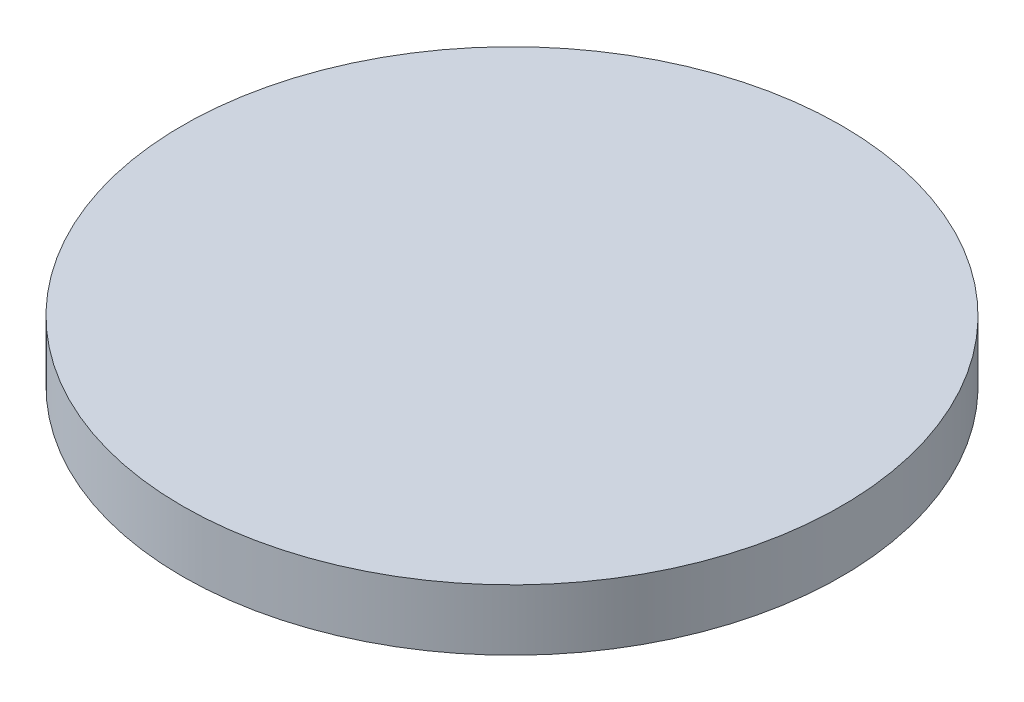
ISO-10303-21;
HEADER;
FILE_DESCRIPTION(('STEP AP214'),'2;1');
FILE_NAME('part.step','',(''),(''),'','','');
FILE_SCHEMA(('AUTOMOTIVE_DESIGN { 1 0 10303 214 1 1 1 1 }'));
ENDSEC;
DATA;
#1=APPLICATION_CONTEXT('core data for automotive mechanical design processes');
#2=APPLICATION_PROTOCOL_DEFINITION('international standard','automotive_design',2000,#1);
#3=PRODUCT_CONTEXT('',#1,'mechanical');
#4=PRODUCT('Part','Part','',(#3));
#5=PRODUCT_RELATED_PRODUCT_CATEGORY('part','',(#4));
#6=PRODUCT_DEFINITION_FORMATION('','',#4);
#7=PRODUCT_DEFINITION_CONTEXT('part definition',#1,'design');
#8=PRODUCT_DEFINITION('design','',#6,#7);
#9=PRODUCT_DEFINITION_SHAPE('','',#8);
#10=(LENGTH_UNIT() NAMED_UNIT(*) SI_UNIT(.MILLI.,.METRE.));
#11=(NAMED_UNIT(*) PLANE_ANGLE_UNIT() SI_UNIT($,.RADIAN.));
#12=(NAMED_UNIT(*) SI_UNIT($,.STERADIAN.) SOLID_ANGLE_UNIT());
#13=UNCERTAINTY_MEASURE_WITH_UNIT(LENGTH_MEASURE(1.E-05),#10,'distance_accuracy_value','');
#14=(GEOMETRIC_REPRESENTATION_CONTEXT(3) GLOBAL_UNCERTAINTY_ASSIGNED_CONTEXT((#13)) GLOBAL_UNIT_ASSIGNED_CONTEXT((#10,
#11,#12)) REPRESENTATION_CONTEXT('',''));
#15=CARTESIAN_POINT('',(0.,0.,0.));
#16=DIRECTION('',(0.,0.,1.));
#17=DIRECTION('',(1.,0.,0.));
#18=AXIS2_PLACEMENT_3D('',#15,#16,#17);
#19=CARTESIAN_POINT('',(0.,7.4,0.));
#20=DIRECTION('',(0.,-1.,0.));
#21=DIRECTION('',(0.,0.,-1.));
#22=AXIS2_PLACEMENT_3D('',#19,#20,#21);
#23=CYLINDRICAL_SURFACE('',#22,40.);
#24=CARTESIAN_POINT('',(0.,7.4,0.));
#25=DIRECTION('',(0.,1.,0.));
#26=DIRECTION('',(0.,0.,1.));
#27=AXIS2_PLACEMENT_3D('',#24,#25,#26);
#28=CIRCLE('',#27,40.);
#29=CARTESIAN_POINT('',(0.,7.4,40.0000000000001));
#30=VERTEX_POINT('',#29);
#31=EDGE_CURVE('E10',#30,#30,#28,.T.);
#32=ORIENTED_EDGE('',*,*,#31,.F.);
#33=EDGE_LOOP('',(#32));
#34=FACE_BOUND('',#33,.T.);
#35=CARTESIAN_POINT('',(0.,0.,0.));
#36=DIRECTION('',(0.,1.,0.));
#37=DIRECTION('',(0.,0.,1.));
#38=AXIS2_PLACEMENT_3D('',#35,#36,#37);
#39=CIRCLE('',#38,40.);
#40=CARTESIAN_POINT('',(0.,0.,40.0000000000001));
#41=VERTEX_POINT('',#40);
#42=EDGE_CURVE('E31',#41,#41,#39,.T.);
#43=ORIENTED_EDGE('',*,*,#42,.T.);
#44=EDGE_LOOP('',(#43));
#45=FACE_BOUND('',#44,.T.);
#46=ADVANCED_FACE('F28',(#34,#45),#23,.T.);
#47=CARTESIAN_POINT('',(0.,7.4,0.));
#48=DIRECTION('',(0.,1.,0.));
#49=DIRECTION('',(0.,0.,1.));
#50=AXIS2_PLACEMENT_3D('',#47,#48,#49);
#51=PLANE('',#50);
#52=ORIENTED_EDGE('',*,*,#31,.T.);
#53=EDGE_LOOP('',(#52));
#54=FACE_BOUND('',#53,.T.);
#55=ADVANCED_FACE('F43',(#54),#51,.T.);
#56=CARTESIAN_POINT('',(0.,0.,0.));
#57=DIRECTION('',(0.,1.,0.));
#58=DIRECTION('',(0.,0.,1.));
#59=AXIS2_PLACEMENT_3D('',#56,#57,#58);
#60=PLANE('',#59);
#61=ORIENTED_EDGE('',*,*,#42,.F.);
#62=EDGE_LOOP('',(#61));
#63=FACE_BOUND('',#62,.T.);
#64=ADVANCED_FACE('F41',(#63),#60,.F.);
#65=CLOSED_SHELL('',(#46,#55,#64));
#66=MANIFOLD_SOLID_BREP('B2',#65);
#67=ADVANCED_BREP_SHAPE_REPRESENTATION('',(#18,#66),#14);
#68=SHAPE_DEFINITION_REPRESENTATION(#9,#67);
ENDSEC;
END-ISO-10303-21;
